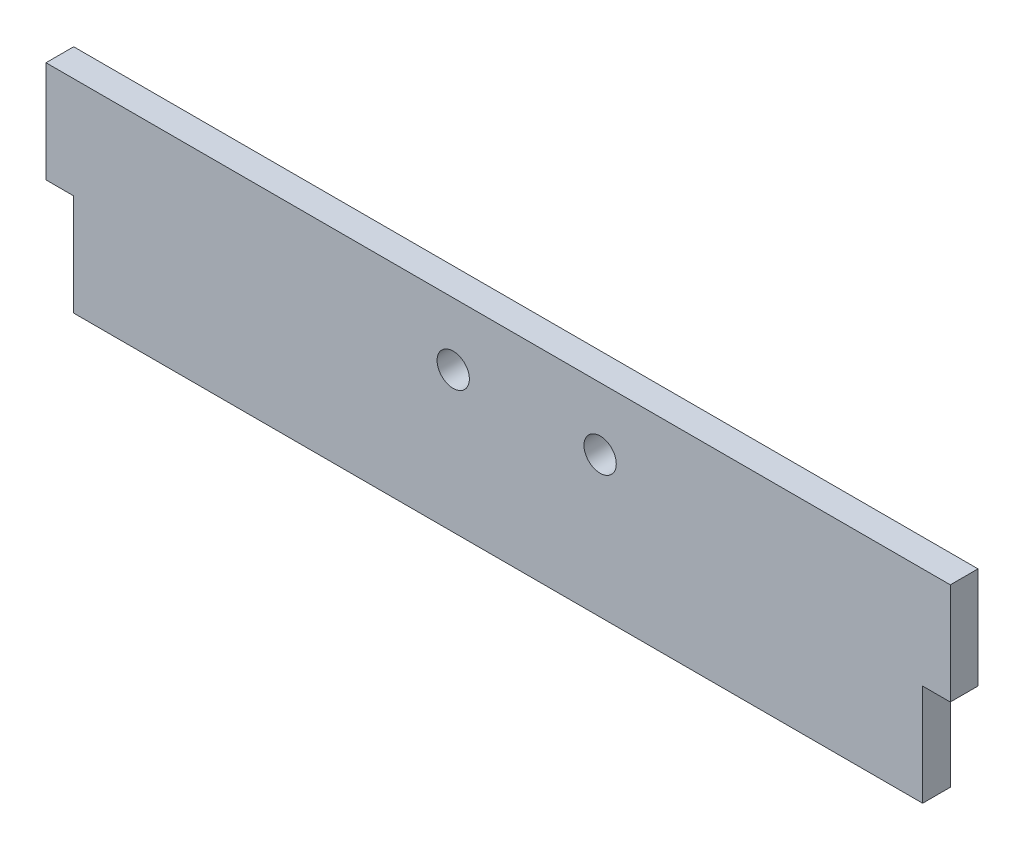
ISO-10303-21;
HEADER;
FILE_DESCRIPTION(('STEP AP214'),'2;1');
FILE_NAME('part.step','',(''),(''),'','','');
FILE_SCHEMA(('AUTOMOTIVE_DESIGN { 1 0 10303 214 1 1 1 1 }'));
ENDSEC;
DATA;
#1=APPLICATION_CONTEXT('core data for automotive mechanical design processes');
#2=APPLICATION_PROTOCOL_DEFINITION('international standard','automotive_design',2000,#1);
#3=PRODUCT_CONTEXT('',#1,'mechanical');
#4=PRODUCT('Part','Part','',(#3));
#5=PRODUCT_RELATED_PRODUCT_CATEGORY('part','',(#4));
#6=PRODUCT_DEFINITION_FORMATION('','',#4);
#7=PRODUCT_DEFINITION_CONTEXT('part definition',#1,'design');
#8=PRODUCT_DEFINITION('design','',#6,#7);
#9=PRODUCT_DEFINITION_SHAPE('','',#8);
#10=(LENGTH_UNIT() NAMED_UNIT(*) SI_UNIT(.MILLI.,.METRE.));
#11=(NAMED_UNIT(*) PLANE_ANGLE_UNIT() SI_UNIT($,.RADIAN.));
#12=(NAMED_UNIT(*) SI_UNIT($,.STERADIAN.) SOLID_ANGLE_UNIT());
#13=UNCERTAINTY_MEASURE_WITH_UNIT(LENGTH_MEASURE(1.E-05),#10,'distance_accuracy_value','');
#14=(GEOMETRIC_REPRESENTATION_CONTEXT(3) GLOBAL_UNCERTAINTY_ASSIGNED_CONTEXT((#13)) GLOBAL_UNIT_ASSIGNED_CONTEXT((#10,
#11,#12)) REPRESENTATION_CONTEXT('',''));
#15=CARTESIAN_POINT('',(0.,0.,0.));
#16=DIRECTION('',(0.,0.,1.));
#17=DIRECTION('',(1.,0.,0.));
#18=AXIS2_PLACEMENT_3D('',#15,#16,#17);
#19=CARTESIAN_POINT('',(46.,0.,3.));
#20=DIRECTION('',(-1.,0.,0.));
#21=DIRECTION('',(0.,0.,1.));
#22=AXIS2_PLACEMENT_3D('',#19,#20,#21);
#23=PLANE('',#22);
#24=DIRECTION('',(0.,1.,0.));
#25=VECTOR('',#24,1.);
#26=CARTESIAN_POINT('',(46.,0.,0.));
#27=LINE('',#26,#25);
#28=CARTESIAN_POINT('',(46.,0.,0.));
#29=VERTEX_POINT('',#28);
#30=CARTESIAN_POINT('',(46.,11.,0.));
#31=VERTEX_POINT('',#30);
#32=EDGE_CURVE('E133',#29,#31,#27,.T.);
#33=ORIENTED_EDGE('',*,*,#32,.T.);
#34=DIRECTION('',(0.,0.,-1.));
#35=VECTOR('',#34,1.);
#36=CARTESIAN_POINT('',(46.,11.,3.));
#37=LINE('',#36,#35);
#38=CARTESIAN_POINT('',(46.,11.,3.));
#39=VERTEX_POINT('',#38);
#40=EDGE_CURVE('E11',#39,#31,#37,.T.);
#41=ORIENTED_EDGE('',*,*,#40,.F.);
#42=DIRECTION('',(0.,1.,0.));
#43=VECTOR('',#42,1.);
#44=CARTESIAN_POINT('',(46.,0.,3.));
#45=LINE('',#44,#43);
#46=CARTESIAN_POINT('',(46.,0.,3.));
#47=VERTEX_POINT('',#46);
#48=EDGE_CURVE('E148',#47,#39,#45,.T.);
#49=ORIENTED_EDGE('',*,*,#48,.F.);
#50=DIRECTION('',(0.,0.,-1.));
#51=VECTOR('',#50,1.);
#52=CARTESIAN_POINT('',(46.,0.,3.));
#53=LINE('',#52,#51);
#54=EDGE_CURVE('E129',#47,#29,#53,.T.);
#55=ORIENTED_EDGE('',*,*,#54,.T.);
#56=EDGE_LOOP('',(#33,#41,#49,#55));
#57=FACE_BOUND('',#56,.T.);
#58=ADVANCED_FACE('F37',(#57),#23,.F.);
#59=CARTESIAN_POINT('',(46.,11.,3.));
#60=DIRECTION('',(0.,1.,0.));
#61=DIRECTION('',(0.,0.,1.));
#62=AXIS2_PLACEMENT_3D('',#59,#60,#61);
#63=PLANE('',#62);
#64=DIRECTION('',(1.,0.,0.));
#65=VECTOR('',#64,1.);
#66=CARTESIAN_POINT('',(46.,11.,0.));
#67=LINE('',#66,#65);
#68=CARTESIAN_POINT('',(49.,11.,0.));
#69=VERTEX_POINT('',#68);
#70=EDGE_CURVE('E136',#31,#69,#67,.T.);
#71=ORIENTED_EDGE('',*,*,#70,.T.);
#72=DIRECTION('',(0.,0.,-1.));
#73=VECTOR('',#72,1.);
#74=CARTESIAN_POINT('',(49.,11.,3.));
#75=LINE('',#74,#73);
#76=CARTESIAN_POINT('',(49.,11.,3.));
#77=VERTEX_POINT('',#76);
#78=EDGE_CURVE('E45',#77,#69,#75,.T.);
#79=ORIENTED_EDGE('',*,*,#78,.F.);
#80=DIRECTION('',(1.,0.,0.));
#81=VECTOR('',#80,1.);
#82=CARTESIAN_POINT('',(46.,11.,3.));
#83=LINE('',#82,#81);
#84=EDGE_CURVE('E96',#39,#77,#83,.T.);
#85=ORIENTED_EDGE('',*,*,#84,.F.);
#86=ORIENTED_EDGE('',*,*,#40,.T.);
#87=EDGE_LOOP('',(#71,#79,#85,#86));
#88=FACE_BOUND('',#87,.T.);
#89=ADVANCED_FACE('F218',(#88),#63,.F.);
#90=CARTESIAN_POINT('',(49.,11.,3.));
#91=DIRECTION('',(-1.,0.,0.));
#92=DIRECTION('',(0.,0.,1.));
#93=AXIS2_PLACEMENT_3D('',#90,#91,#92);
#94=PLANE('',#93);
#95=DIRECTION('',(0.,1.,0.));
#96=VECTOR('',#95,1.);
#97=CARTESIAN_POINT('',(49.,11.,0.));
#98=LINE('',#97,#96);
#99=CARTESIAN_POINT('',(49.,22.,0.));
#100=VERTEX_POINT('',#99);
#101=EDGE_CURVE('E139',#69,#100,#98,.T.);
#102=ORIENTED_EDGE('',*,*,#101,.T.);
#103=DIRECTION('',(0.,0.,-1.));
#104=VECTOR('',#103,1.);
#105=CARTESIAN_POINT('',(49.,22.,3.));
#106=LINE('',#105,#104);
#107=CARTESIAN_POINT('',(49.,22.,3.));
#108=VERTEX_POINT('',#107);
#109=EDGE_CURVE('E155',#108,#100,#106,.T.);
#110=ORIENTED_EDGE('',*,*,#109,.F.);
#111=DIRECTION('',(0.,1.,0.));
#112=VECTOR('',#111,1.);
#113=CARTESIAN_POINT('',(49.,11.,3.));
#114=LINE('',#113,#112);
#115=EDGE_CURVE('E163',#77,#108,#114,.T.);
#116=ORIENTED_EDGE('',*,*,#115,.F.);
#117=ORIENTED_EDGE('',*,*,#78,.T.);
#118=EDGE_LOOP('',(#102,#110,#116,#117));
#119=FACE_BOUND('',#118,.T.);
#120=ADVANCED_FACE('F161',(#119),#94,.F.);
#121=CARTESIAN_POINT('',(49.,22.,3.));
#122=DIRECTION('',(0.,-1.,0.));
#123=DIRECTION('',(0.,0.,-1.));
#124=AXIS2_PLACEMENT_3D('',#121,#122,#123);
#125=PLANE('',#124);
#126=DIRECTION('',(-1.,0.,0.));
#127=VECTOR('',#126,1.);
#128=CARTESIAN_POINT('',(49.,22.,0.));
#129=LINE('',#128,#127);
#130=CARTESIAN_POINT('',(-49.,22.,0.));
#131=VERTEX_POINT('',#130);
#132=EDGE_CURVE('E141',#100,#131,#129,.T.);
#133=ORIENTED_EDGE('',*,*,#132,.T.);
#134=DIRECTION('',(0.,0.,-1.));
#135=VECTOR('',#134,1.);
#136=CARTESIAN_POINT('',(-49.,22.,3.));
#137=LINE('',#136,#135);
#138=CARTESIAN_POINT('',(-49.,22.,3.));
#139=VERTEX_POINT('',#138);
#140=EDGE_CURVE('E152',#139,#131,#137,.T.);
#141=ORIENTED_EDGE('',*,*,#140,.F.);
#142=DIRECTION('',(-1.,0.,0.));
#143=VECTOR('',#142,1.);
#144=CARTESIAN_POINT('',(49.,22.,3.));
#145=LINE('',#144,#143);
#146=EDGE_CURVE('E175',#108,#139,#145,.T.);
#147=ORIENTED_EDGE('',*,*,#146,.F.);
#148=ORIENTED_EDGE('',*,*,#109,.T.);
#149=EDGE_LOOP('',(#133,#141,#147,#148));
#150=FACE_BOUND('',#149,.T.);
#151=ADVANCED_FACE('F171',(#150),#125,.F.);
#152=CARTESIAN_POINT('',(-49.,11.,3.));
#153=DIRECTION('',(1.,0.,0.));
#154=DIRECTION('',(0.,0.,-1.));
#155=AXIS2_PLACEMENT_3D('',#152,#153,#154);
#156=PLANE('',#155);
#157=DIRECTION('',(0.,-1.,0.));
#158=VECTOR('',#157,1.);
#159=CARTESIAN_POINT('',(-49.,11.,0.));
#160=LINE('',#159,#158);
#161=CARTESIAN_POINT('',(-49.,11.,0.));
#162=VERTEX_POINT('',#161);
#163=EDGE_CURVE('E143',#131,#162,#160,.T.);
#164=ORIENTED_EDGE('',*,*,#163,.T.);
#165=DIRECTION('',(0.,0.,-1.));
#166=VECTOR('',#165,1.);
#167=CARTESIAN_POINT('',(-49.,11.,3.));
#168=LINE('',#167,#166);
#169=CARTESIAN_POINT('',(-49.,11.,3.));
#170=VERTEX_POINT('',#169);
#171=EDGE_CURVE('E124',#170,#162,#168,.T.);
#172=ORIENTED_EDGE('',*,*,#171,.F.);
#173=DIRECTION('',(0.,-1.,0.));
#174=VECTOR('',#173,1.);
#175=CARTESIAN_POINT('',(-49.,11.,3.));
#176=LINE('',#175,#174);
#177=EDGE_CURVE('E115',#139,#170,#176,.T.);
#178=ORIENTED_EDGE('',*,*,#177,.F.);
#179=ORIENTED_EDGE('',*,*,#140,.T.);
#180=EDGE_LOOP('',(#164,#172,#178,#179));
#181=FACE_BOUND('',#180,.T.);
#182=ADVANCED_FACE('F174',(#181),#156,.F.);
#183=CARTESIAN_POINT('',(-46.,11.,3.));
#184=DIRECTION('',(0.,1.,0.));
#185=DIRECTION('',(0.,0.,1.));
#186=AXIS2_PLACEMENT_3D('',#183,#184,#185);
#187=PLANE('',#186);
#188=DIRECTION('',(1.,0.,0.));
#189=VECTOR('',#188,1.);
#190=CARTESIAN_POINT('',(-46.,11.,0.));
#191=LINE('',#190,#189);
#192=CARTESIAN_POINT('',(-46.,11.,0.));
#193=VERTEX_POINT('',#192);
#194=EDGE_CURVE('E123',#162,#193,#191,.T.);
#195=ORIENTED_EDGE('',*,*,#194,.T.);
#196=DIRECTION('',(0.,0.,-1.));
#197=VECTOR('',#196,1.);
#198=CARTESIAN_POINT('',(-46.,11.,3.));
#199=LINE('',#198,#197);
#200=CARTESIAN_POINT('',(-46.,11.,3.));
#201=VERTEX_POINT('',#200);
#202=EDGE_CURVE('E120',#201,#193,#199,.T.);
#203=ORIENTED_EDGE('',*,*,#202,.F.);
#204=DIRECTION('',(1.,0.,0.));
#205=VECTOR('',#204,1.);
#206=CARTESIAN_POINT('',(-46.,11.,3.));
#207=LINE('',#206,#205);
#208=EDGE_CURVE('E109',#170,#201,#207,.T.);
#209=ORIENTED_EDGE('',*,*,#208,.F.);
#210=ORIENTED_EDGE('',*,*,#171,.T.);
#211=EDGE_LOOP('',(#195,#203,#209,#210));
#212=FACE_BOUND('',#211,.T.);
#213=ADVANCED_FACE('F121',(#212),#187,.F.);
#214=CARTESIAN_POINT('',(-46.,0.,3.));
#215=DIRECTION('',(1.,0.,0.));
#216=DIRECTION('',(0.,0.,-1.));
#217=AXIS2_PLACEMENT_3D('',#214,#215,#216);
#218=PLANE('',#217);
#219=DIRECTION('',(0.,-1.,0.));
#220=VECTOR('',#219,1.);
#221=CARTESIAN_POINT('',(-46.,0.,0.));
#222=LINE('',#221,#220);
#223=CARTESIAN_POINT('',(-46.,0.,0.));
#224=VERTEX_POINT('',#223);
#225=EDGE_CURVE('E82',#193,#224,#222,.T.);
#226=ORIENTED_EDGE('',*,*,#225,.T.);
#227=DIRECTION('',(0.,0.,-1.));
#228=VECTOR('',#227,1.);
#229=CARTESIAN_POINT('',(-46.,0.,3.));
#230=LINE('',#229,#228);
#231=CARTESIAN_POINT('',(-46.,0.,3.));
#232=VERTEX_POINT('',#231);
#233=EDGE_CURVE('E125',#232,#224,#230,.T.);
#234=ORIENTED_EDGE('',*,*,#233,.F.);
#235=DIRECTION('',(0.,-1.,0.));
#236=VECTOR('',#235,1.);
#237=CARTESIAN_POINT('',(-46.,0.,3.));
#238=LINE('',#237,#236);
#239=EDGE_CURVE('E113',#201,#232,#238,.T.);
#240=ORIENTED_EDGE('',*,*,#239,.F.);
#241=ORIENTED_EDGE('',*,*,#202,.T.);
#242=EDGE_LOOP('',(#226,#234,#240,#241));
#243=FACE_BOUND('',#242,.T.);
#244=ADVANCED_FACE('F127',(#243),#218,.F.);
#245=CARTESIAN_POINT('',(-46.,0.,3.));
#246=DIRECTION('',(0.,1.,0.));
#247=DIRECTION('',(0.,0.,1.));
#248=AXIS2_PLACEMENT_3D('',#245,#246,#247);
#249=PLANE('',#248);
#250=DIRECTION('',(1.,0.,0.));
#251=VECTOR('',#250,1.);
#252=CARTESIAN_POINT('',(-46.,0.,0.));
#253=LINE('',#252,#251);
#254=EDGE_CURVE('E88',#224,#29,#253,.T.);
#255=ORIENTED_EDGE('',*,*,#254,.T.);
#256=ORIENTED_EDGE('',*,*,#54,.F.);
#257=DIRECTION('',(1.,0.,0.));
#258=VECTOR('',#257,1.);
#259=CARTESIAN_POINT('',(-46.,0.,3.));
#260=LINE('',#259,#258);
#261=EDGE_CURVE('E53',#232,#47,#260,.T.);
#262=ORIENTED_EDGE('',*,*,#261,.F.);
#263=ORIENTED_EDGE('',*,*,#233,.T.);
#264=EDGE_LOOP('',(#255,#256,#262,#263));
#265=FACE_BOUND('',#264,.T.);
#266=ADVANCED_FACE('F204',(#265),#249,.F.);
#267=CARTESIAN_POINT('',(0.,0.,3.));
#268=DIRECTION('',(0.,0.,-1.));
#269=DIRECTION('',(-1.,0.,0.));
#270=AXIS2_PLACEMENT_3D('',#267,#268,#269);
#271=PLANE('',#270);
#272=CARTESIAN_POINT('',(-4.87030586401094,15.2494620503845,3.));
#273=DIRECTION('',(0.,0.,1.));
#274=DIRECTION('',(1.,0.,0.));
#275=AXIS2_PLACEMENT_3D('',#272,#273,#274);
#276=CIRCLE('',#275,1.75);
#277=CARTESIAN_POINT('',(-3.12030586401094,15.2494620503845,3.));
#278=VERTEX_POINT('',#277);
#279=EDGE_CURVE('E187',#278,#278,#276,.T.);
#280=ORIENTED_EDGE('',*,*,#279,.F.);
#281=EDGE_LOOP('',(#280));
#282=FACE_BOUND('',#281,.T.);
#283=CARTESIAN_POINT('',(11.0508409497143,15.2494620503845,3.));
#284=DIRECTION('',(0.,0.,1.));
#285=DIRECTION('',(1.,0.,0.));
#286=AXIS2_PLACEMENT_3D('',#283,#284,#285);
#287=CIRCLE('',#286,1.75);
#288=CARTESIAN_POINT('',(12.8008409497143,15.2494620503845,3.));
#289=VERTEX_POINT('',#288);
#290=EDGE_CURVE('E181',#289,#289,#287,.T.);
#291=ORIENTED_EDGE('',*,*,#290,.F.);
#292=EDGE_LOOP('',(#291));
#293=FACE_BOUND('',#292,.T.);
#294=ORIENTED_EDGE('',*,*,#48,.T.);
#295=ORIENTED_EDGE('',*,*,#84,.T.);
#296=ORIENTED_EDGE('',*,*,#115,.T.);
#297=ORIENTED_EDGE('',*,*,#146,.T.);
#298=ORIENTED_EDGE('',*,*,#177,.T.);
#299=ORIENTED_EDGE('',*,*,#208,.T.);
#300=ORIENTED_EDGE('',*,*,#239,.T.);
#301=ORIENTED_EDGE('',*,*,#261,.T.);
#302=EDGE_LOOP('',(#294,#295,#296,#297,#298,#299,#300,#301));
#303=FACE_BOUND('',#302,.T.);
#304=ADVANCED_FACE('F111',(#282,#293,#303),#271,.F.);
#305=CARTESIAN_POINT('',(0.,0.,0.));
#306=DIRECTION('',(0.,0.,-1.));
#307=DIRECTION('',(-1.,0.,0.));
#308=AXIS2_PLACEMENT_3D('',#305,#306,#307);
#309=PLANE('',#308);
#310=CARTESIAN_POINT('',(-4.87030586401094,15.2494620503845,0.));
#311=DIRECTION('',(0.,0.,1.));
#312=DIRECTION('',(1.,0.,0.));
#313=AXIS2_PLACEMENT_3D('',#310,#311,#312);
#314=CIRCLE('',#313,1.75);
#315=CARTESIAN_POINT('',(-3.12030586401094,15.2494620503845,0.));
#316=VERTEX_POINT('',#315);
#317=EDGE_CURVE('E137',#316,#316,#314,.T.);
#318=ORIENTED_EDGE('',*,*,#317,.T.);
#319=EDGE_LOOP('',(#318));
#320=FACE_BOUND('',#319,.T.);
#321=CARTESIAN_POINT('',(11.0508409497143,15.2494620503845,0.));
#322=DIRECTION('',(0.,0.,1.));
#323=DIRECTION('',(1.,0.,0.));
#324=AXIS2_PLACEMENT_3D('',#321,#322,#323);
#325=CIRCLE('',#324,1.75);
#326=CARTESIAN_POINT('',(12.8008409497143,15.2494620503845,0.));
#327=VERTEX_POINT('',#326);
#328=EDGE_CURVE('E184',#327,#327,#325,.T.);
#329=ORIENTED_EDGE('',*,*,#328,.T.);
#330=EDGE_LOOP('',(#329));
#331=FACE_BOUND('',#330,.T.);
#332=ORIENTED_EDGE('',*,*,#32,.F.);
#333=ORIENTED_EDGE('',*,*,#254,.F.);
#334=ORIENTED_EDGE('',*,*,#225,.F.);
#335=ORIENTED_EDGE('',*,*,#194,.F.);
#336=ORIENTED_EDGE('',*,*,#163,.F.);
#337=ORIENTED_EDGE('',*,*,#132,.F.);
#338=ORIENTED_EDGE('',*,*,#101,.F.);
#339=ORIENTED_EDGE('',*,*,#70,.F.);
#340=EDGE_LOOP('',(#332,#333,#334,#335,#336,#337,#338,#339));
#341=FACE_BOUND('',#340,.T.);
#342=ADVANCED_FACE('F167',(#320,#331,#341),#309,.T.);
#343=CARTESIAN_POINT('',(11.0508409497143,15.2494620503845,0.));
#344=DIRECTION('',(0.,0.,1.));
#345=DIRECTION('',(1.,0.,0.));
#346=AXIS2_PLACEMENT_3D('',#343,#344,#345);
#347=CYLINDRICAL_SURFACE('',#346,1.75);
#348=ORIENTED_EDGE('',*,*,#328,.F.);
#349=EDGE_LOOP('',(#348));
#350=FACE_BOUND('',#349,.T.);
#351=ORIENTED_EDGE('',*,*,#290,.T.);
#352=EDGE_LOOP('',(#351));
#353=FACE_BOUND('',#352,.T.);
#354=ADVANCED_FACE('F198',(#350,#353),#347,.F.);
#355=CARTESIAN_POINT('',(-4.87030586401094,15.2494620503845,0.));
#356=DIRECTION('',(0.,0.,1.));
#357=DIRECTION('',(1.,0.,0.));
#358=AXIS2_PLACEMENT_3D('',#355,#356,#357);
#359=CYLINDRICAL_SURFACE('',#358,1.75);
#360=ORIENTED_EDGE('',*,*,#317,.F.);
#361=EDGE_LOOP('',(#360));
#362=FACE_BOUND('',#361,.T.);
#363=ORIENTED_EDGE('',*,*,#279,.T.);
#364=EDGE_LOOP('',(#363));
#365=FACE_BOUND('',#364,.T.);
#366=ADVANCED_FACE('F195',(#362,#365),#359,.F.);
#367=CLOSED_SHELL('',(#58,#89,#120,#151,#182,#213,#244,#266,#304,#342,#354,#366));
#368=MANIFOLD_SOLID_BREP('B2',#367);
#369=ADVANCED_BREP_SHAPE_REPRESENTATION('',(#18,#368),#14);
#370=SHAPE_DEFINITION_REPRESENTATION(#9,#369);
ENDSEC;
END-ISO-10303-21;
